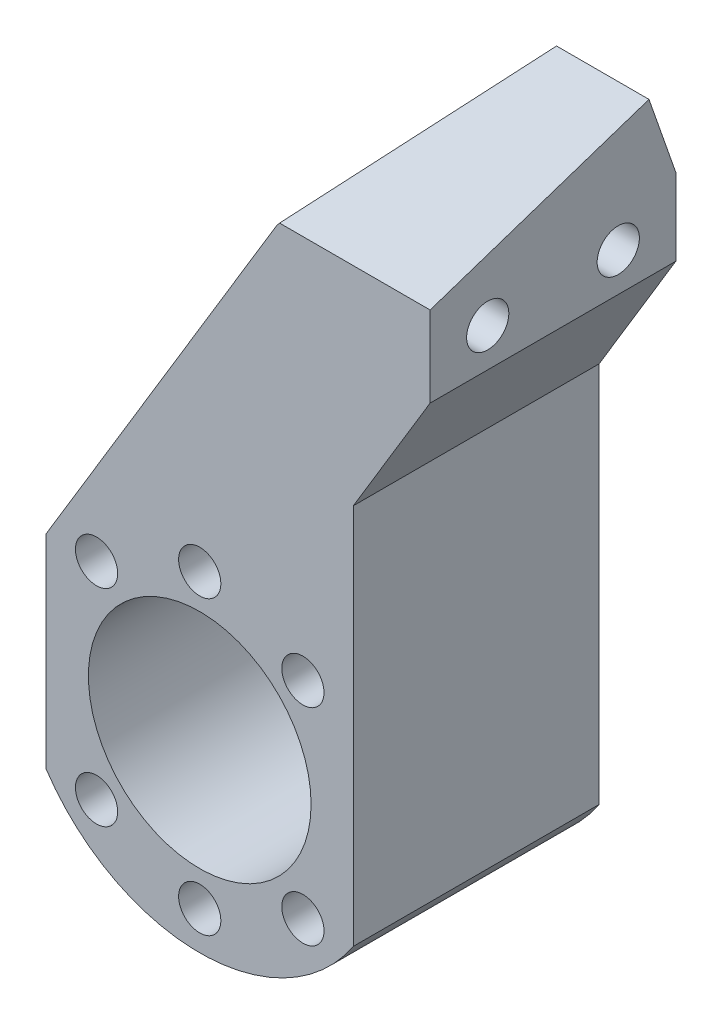
ISO-10303-21;
HEADER;
FILE_DESCRIPTION(('STEP AP214'),'2;1');
FILE_NAME('part.step','',(''),(''),'','','');
FILE_SCHEMA(('AUTOMOTIVE_DESIGN { 1 0 10303 214 1 1 1 1 }'));
ENDSEC;
DATA;
#1=APPLICATION_CONTEXT('core data for automotive mechanical design processes');
#2=APPLICATION_PROTOCOL_DEFINITION('international standard','automotive_design',2000,#1);
#3=PRODUCT_CONTEXT('',#1,'mechanical');
#4=PRODUCT('Part','Part','',(#3));
#5=PRODUCT_RELATED_PRODUCT_CATEGORY('part','',(#4));
#6=PRODUCT_DEFINITION_FORMATION('','',#4);
#7=PRODUCT_DEFINITION_CONTEXT('part definition',#1,'design');
#8=PRODUCT_DEFINITION('design','',#6,#7);
#9=PRODUCT_DEFINITION_SHAPE('','',#8);
#10=(LENGTH_UNIT() NAMED_UNIT(*) SI_UNIT(.MILLI.,.METRE.));
#11=(NAMED_UNIT(*) PLANE_ANGLE_UNIT() SI_UNIT($,.RADIAN.));
#12=(NAMED_UNIT(*) SI_UNIT($,.STERADIAN.) SOLID_ANGLE_UNIT());
#13=UNCERTAINTY_MEASURE_WITH_UNIT(LENGTH_MEASURE(1.E-05),#10,'distance_accuracy_value','');
#14=(GEOMETRIC_REPRESENTATION_CONTEXT(3) GLOBAL_UNCERTAINTY_ASSIGNED_CONTEXT((#13)) GLOBAL_UNIT_ASSIGNED_CONTEXT((#10,
#11,#12)) REPRESENTATION_CONTEXT('',''));
#15=CARTESIAN_POINT('',(0.,0.,0.));
#16=DIRECTION('',(0.,0.,1.));
#17=DIRECTION('',(1.,0.,0.));
#18=AXIS2_PLACEMENT_3D('',#15,#16,#17);
#19=CARTESIAN_POINT('',(0.,0.,32.));
#20=DIRECTION('',(0.,0.,-1.));
#21=DIRECTION('',(-1.,0.,0.));
#22=AXIS2_PLACEMENT_3D('',#19,#20,#21);
#23=PLANE('',#22);
#24=DIRECTION('',(1.,0.,0.));
#25=VECTOR('',#24,1.);
#26=CARTESIAN_POINT('',(10.,63.5009960714216,32.));
#27=LINE('',#26,#25);
#28=CARTESIAN_POINT('',(10.3981382458224,63.5009960714216,32.));
#29=VERTEX_POINT('',#28);
#30=CARTESIAN_POINT('',(30.,63.5009960714216,32.));
#31=VERTEX_POINT('',#30);
#32=EDGE_CURVE('E174',#29,#31,#27,.T.);
#33=ORIENTED_EDGE('',*,*,#32,.F.);
#34=DIRECTION('',(0.622917300632838,0.782287694248285,0.));
#35=VECTOR('',#34,1.);
#36=CARTESIAN_POINT('',(10.,63.0009960714216,32.));
#37=LINE('',#36,#35);
#38=CARTESIAN_POINT('',(10.,63.0009960714216,32.));
#39=VERTEX_POINT('',#38);
#40=EDGE_CURVE('E186',#39,#29,#37,.T.);
#41=ORIENTED_EDGE('',*,*,#40,.F.);
#42=DIRECTION('',(-0.516511027740022,-0.856280537103901,0.));
#43=VECTOR('',#42,1.);
#44=CARTESIAN_POINT('',(10.,63.0009960714216,32.));
#45=LINE('',#44,#43);
#46=CARTESIAN_POINT('',(-20.,13.2664991614216,32.));
#47=VERTEX_POINT('',#46);
#48=EDGE_CURVE('E168',#39,#47,#45,.T.);
#49=ORIENTED_EDGE('',*,*,#48,.T.);
#50=DIRECTION('',(0.,-1.,0.));
#51=VECTOR('',#50,1.);
#52=CARTESIAN_POINT('',(-20.,13.2664991614216,32.));
#53=LINE('',#52,#51);
#54=CARTESIAN_POINT('',(-20.,-13.2664991614216,32.));
#55=VERTEX_POINT('',#54);
#56=EDGE_CURVE('E259',#47,#55,#53,.T.);
#57=ORIENTED_EDGE('',*,*,#56,.T.);
#58=CARTESIAN_POINT('',(0.,0.,32.));
#59=DIRECTION('',(0.,0.,1.));
#60=DIRECTION('',(1.,0.,0.));
#61=AXIS2_PLACEMENT_3D('',#58,#59,#60);
#62=CIRCLE('',#61,24.);
#63=CARTESIAN_POINT('',(20.,-13.2664991614216,32.));
#64=VERTEX_POINT('',#63);
#65=EDGE_CURVE('E261',#55,#64,#62,.T.);
#66=ORIENTED_EDGE('',*,*,#65,.T.);
#67=DIRECTION('',(0.,1.,0.));
#68=VECTOR('',#67,1.);
#69=CARTESIAN_POINT('',(20.,13.2664991614216,32.));
#70=LINE('',#69,#68);
#71=CARTESIAN_POINT('',(20.,36.4228304347549,32.));
#72=VERTEX_POINT('',#71);
#73=EDGE_CURVE('E256',#64,#72,#70,.T.);
#74=ORIENTED_EDGE('',*,*,#73,.T.);
#75=DIRECTION('',(0.516511027740023,0.856280537103902,0.));
#76=VECTOR('',#75,1.);
#77=CARTESIAN_POINT('',(20.,36.4228304347549,32.));
#78=LINE('',#77,#76);
#79=CARTESIAN_POINT('',(30.,53.0009960714216,32.));
#80=VERTEX_POINT('',#79);
#81=EDGE_CURVE('E166',#72,#80,#78,.T.);
#82=ORIENTED_EDGE('',*,*,#81,.T.);
#83=DIRECTION('',(0.,1.,0.));
#84=VECTOR('',#83,1.);
#85=CARTESIAN_POINT('',(30.,63.0009960714216,32.));
#86=LINE('',#85,#84);
#87=EDGE_CURVE('E154',#80,#31,#86,.T.);
#88=ORIENTED_EDGE('',*,*,#87,.T.);
#89=EDGE_LOOP('',(#33,#41,#49,#57,#66,#74,#82,#88));
#90=FACE_BOUND('',#89,.T.);
#91=CARTESIAN_POINT('',(0.,0.,32.));
#92=DIRECTION('',(0.,0.,1.));
#93=DIRECTION('',(1.,0.,0.));
#94=AXIS2_PLACEMENT_3D('',#91,#92,#93);
#95=CIRCLE('',#94,14.5);
#96=CARTESIAN_POINT('',(14.5,0.,32.));
#97=VERTEX_POINT('',#96);
#98=EDGE_CURVE('E265',#97,#97,#95,.T.);
#99=ORIENTED_EDGE('',*,*,#98,.F.);
#100=EDGE_LOOP('',(#99));
#101=FACE_BOUND('',#100,.T.);
#102=CARTESIAN_POINT('',(0.,19.,32.));
#103=DIRECTION('',(0.,0.,1.));
#104=DIRECTION('',(1.,0.,0.));
#105=AXIS2_PLACEMENT_3D('',#102,#103,#104);
#106=CIRCLE('',#105,2.75);
#107=CARTESIAN_POINT('',(2.75,19.,32.));
#108=VERTEX_POINT('',#107);
#109=EDGE_CURVE('E271',#108,#108,#106,.T.);
#110=ORIENTED_EDGE('',*,*,#109,.F.);
#111=EDGE_LOOP('',(#110));
#112=FACE_BOUND('',#111,.T.);
#113=CARTESIAN_POINT('',(-13.4350288425444,13.4350288425444,32.));
#114=DIRECTION('',(0.,0.,1.));
#115=DIRECTION('',(1.,0.,0.));
#116=AXIS2_PLACEMENT_3D('',#113,#114,#115);
#117=CIRCLE('',#116,2.75);
#118=CARTESIAN_POINT('',(-10.6850288425444,13.4350288425444,32.));
#119=VERTEX_POINT('',#118);
#120=EDGE_CURVE('E277',#119,#119,#117,.T.);
#121=ORIENTED_EDGE('',*,*,#120,.F.);
#122=EDGE_LOOP('',(#121));
#123=FACE_BOUND('',#122,.T.);
#124=CARTESIAN_POINT('',(13.4350288425444,13.4350288425444,32.));
#125=DIRECTION('',(0.,0.,1.));
#126=DIRECTION('',(1.,0.,0.));
#127=AXIS2_PLACEMENT_3D('',#124,#125,#126);
#128=CIRCLE('',#127,2.75);
#129=CARTESIAN_POINT('',(16.1850288425444,13.4350288425444,32.));
#130=VERTEX_POINT('',#129);
#131=EDGE_CURVE('E283',#130,#130,#128,.T.);
#132=ORIENTED_EDGE('',*,*,#131,.F.);
#133=EDGE_LOOP('',(#132));
#134=FACE_BOUND('',#133,.T.);
#135=CARTESIAN_POINT('',(0.,-19.,32.));
#136=DIRECTION('',(0.,0.,1.));
#137=DIRECTION('',(1.,0.,0.));
#138=AXIS2_PLACEMENT_3D('',#135,#136,#137);
#139=CIRCLE('',#138,2.75);
#140=CARTESIAN_POINT('',(2.75,-19.,32.));
#141=VERTEX_POINT('',#140);
#142=EDGE_CURVE('E289',#141,#141,#139,.T.);
#143=ORIENTED_EDGE('',*,*,#142,.F.);
#144=EDGE_LOOP('',(#143));
#145=FACE_BOUND('',#144,.T.);
#146=CARTESIAN_POINT('',(13.4350288425444,-13.4350288425444,32.));
#147=DIRECTION('',(0.,0.,1.));
#148=DIRECTION('',(1.,0.,0.));
#149=AXIS2_PLACEMENT_3D('',#146,#147,#148);
#150=CIRCLE('',#149,2.75);
#151=CARTESIAN_POINT('',(16.1850288425444,-13.4350288425444,32.));
#152=VERTEX_POINT('',#151);
#153=EDGE_CURVE('E295',#152,#152,#150,.T.);
#154=ORIENTED_EDGE('',*,*,#153,.F.);
#155=EDGE_LOOP('',(#154));
#156=FACE_BOUND('',#155,.T.);
#157=CARTESIAN_POINT('',(-13.4350288425444,-13.4350288425444,32.));
#158=DIRECTION('',(0.,0.,1.));
#159=DIRECTION('',(1.,0.,0.));
#160=AXIS2_PLACEMENT_3D('',#157,#158,#159);
#161=CIRCLE('',#160,2.75);
#162=CARTESIAN_POINT('',(-10.6850288425444,-13.4350288425444,32.));
#163=VERTEX_POINT('',#162);
#164=EDGE_CURVE('E301',#163,#163,#161,.T.);
#165=ORIENTED_EDGE('',*,*,#164,.F.);
#166=EDGE_LOOP('',(#165));
#167=FACE_BOUND('',#166,.T.);
#168=ADVANCED_FACE('F39',(#90,#101,#112,#123,#134,#145,#156,#167),#23,.F.);
#169=CARTESIAN_POINT('',(0.,0.,0.));
#170=DIRECTION('',(0.,0.,-1.));
#171=DIRECTION('',(-1.,0.,0.));
#172=AXIS2_PLACEMENT_3D('',#169,#170,#171);
#173=PLANE('',#172);
#174=CARTESIAN_POINT('',(13.4350288425444,-13.4350288425444,0.));
#175=DIRECTION('',(0.,0.,1.));
#176=DIRECTION('',(1.,0.,0.));
#177=AXIS2_PLACEMENT_3D('',#174,#175,#176);
#178=CIRCLE('',#177,2.75);
#179=CARTESIAN_POINT('',(16.1850288425444,-13.4350288425444,0.));
#180=VERTEX_POINT('',#179);
#181=EDGE_CURVE('E298',#180,#180,#178,.T.);
#182=ORIENTED_EDGE('',*,*,#181,.T.);
#183=EDGE_LOOP('',(#182));
#184=FACE_BOUND('',#183,.T.);
#185=CARTESIAN_POINT('',(13.4350288425444,13.4350288425444,0.));
#186=DIRECTION('',(0.,0.,1.));
#187=DIRECTION('',(1.,0.,0.));
#188=AXIS2_PLACEMENT_3D('',#185,#186,#187);
#189=CIRCLE('',#188,2.75);
#190=CARTESIAN_POINT('',(16.1850288425444,13.4350288425444,0.));
#191=VERTEX_POINT('',#190);
#192=EDGE_CURVE('E286',#191,#191,#189,.T.);
#193=ORIENTED_EDGE('',*,*,#192,.T.);
#194=EDGE_LOOP('',(#193));
#195=FACE_BOUND('',#194,.T.);
#196=CARTESIAN_POINT('',(0.,19.,0.));
#197=DIRECTION('',(0.,0.,1.));
#198=DIRECTION('',(1.,0.,0.));
#199=AXIS2_PLACEMENT_3D('',#196,#197,#198);
#200=CIRCLE('',#199,2.75);
#201=CARTESIAN_POINT('',(2.75,19.,0.));
#202=VERTEX_POINT('',#201);
#203=EDGE_CURVE('E274',#202,#202,#200,.T.);
#204=ORIENTED_EDGE('',*,*,#203,.T.);
#205=EDGE_LOOP('',(#204));
#206=FACE_BOUND('',#205,.T.);
#207=DIRECTION('',(0.,-1.,0.));
#208=VECTOR('',#207,1.);
#209=CARTESIAN_POINT('',(-20.,13.2664991614216,0.));
#210=LINE('',#209,#208);
#211=CARTESIAN_POINT('',(-20.,13.2664991614216,0.));
#212=VERTEX_POINT('',#211);
#213=CARTESIAN_POINT('',(-20.,-13.2664991614216,0.));
#214=VERTEX_POINT('',#213);
#215=EDGE_CURVE('E253',#212,#214,#210,.T.);
#216=ORIENTED_EDGE('',*,*,#215,.F.);
#217=DIRECTION('',(0.516511027740022,0.856280537103902,0.));
#218=VECTOR('',#217,1.);
#219=CARTESIAN_POINT('',(10.,63.0009960714216,0.));
#220=LINE('',#219,#218);
#221=CARTESIAN_POINT('',(10.,63.0009960714216,0.));
#222=VERTEX_POINT('',#221);
#223=EDGE_CURVE('E162',#212,#222,#220,.T.);
#224=ORIENTED_EDGE('',*,*,#223,.T.);
#225=DIRECTION('',(1.,0.,0.));
#226=VECTOR('',#225,1.);
#227=CARTESIAN_POINT('',(10.,63.0009960714216,0.));
#228=LINE('',#227,#226);
#229=CARTESIAN_POINT('',(30.,63.0009960714216,0.));
#230=VERTEX_POINT('',#229);
#231=EDGE_CURVE('E159',#222,#230,#228,.T.);
#232=ORIENTED_EDGE('',*,*,#231,.T.);
#233=DIRECTION('',(0.,-1.,0.));
#234=VECTOR('',#233,1.);
#235=CARTESIAN_POINT('',(30.,63.0009960714216,0.));
#236=LINE('',#235,#234);
#237=CARTESIAN_POINT('',(30.,53.0009960714216,0.));
#238=VERTEX_POINT('',#237);
#239=EDGE_CURVE('E140',#230,#238,#236,.T.);
#240=ORIENTED_EDGE('',*,*,#239,.T.);
#241=DIRECTION('',(-0.516511027740022,-0.856280537103901,0.));
#242=VECTOR('',#241,1.);
#243=CARTESIAN_POINT('',(20.,36.4228304347549,0.));
#244=LINE('',#243,#242);
#245=CARTESIAN_POINT('',(20.,36.4228304347549,0.));
#246=VERTEX_POINT('',#245);
#247=EDGE_CURVE('E136',#238,#246,#244,.T.);
#248=ORIENTED_EDGE('',*,*,#247,.T.);
#249=DIRECTION('',(0.,1.,0.));
#250=VECTOR('',#249,1.);
#251=CARTESIAN_POINT('',(20.,13.2664991614216,0.));
#252=LINE('',#251,#250);
#253=CARTESIAN_POINT('',(20.,-13.2664991614216,0.));
#254=VERTEX_POINT('',#253);
#255=EDGE_CURVE('E252',#254,#246,#252,.T.);
#256=ORIENTED_EDGE('',*,*,#255,.F.);
#257=CARTESIAN_POINT('',(0.,0.,0.));
#258=DIRECTION('',(0.,0.,1.));
#259=DIRECTION('',(1.,0.,0.));
#260=AXIS2_PLACEMENT_3D('',#257,#258,#259);
#261=CIRCLE('',#260,24.);
#262=EDGE_CURVE('E244',#214,#254,#261,.T.);
#263=ORIENTED_EDGE('',*,*,#262,.F.);
#264=EDGE_LOOP('',(#216,#224,#232,#240,#248,#256,#263));
#265=FACE_BOUND('',#264,.T.);
#266=CARTESIAN_POINT('',(0.,0.,0.));
#267=DIRECTION('',(0.,0.,1.));
#268=DIRECTION('',(1.,0.,0.));
#269=AXIS2_PLACEMENT_3D('',#266,#267,#268);
#270=CIRCLE('',#269,14.5);
#271=CARTESIAN_POINT('',(14.5,0.,0.));
#272=VERTEX_POINT('',#271);
#273=EDGE_CURVE('E268',#272,#272,#270,.T.);
#274=ORIENTED_EDGE('',*,*,#273,.T.);
#275=EDGE_LOOP('',(#274));
#276=FACE_BOUND('',#275,.T.);
#277=CARTESIAN_POINT('',(-13.4350288425444,13.4350288425444,0.));
#278=DIRECTION('',(0.,0.,1.));
#279=DIRECTION('',(1.,0.,0.));
#280=AXIS2_PLACEMENT_3D('',#277,#278,#279);
#281=CIRCLE('',#280,2.75);
#282=CARTESIAN_POINT('',(-10.6850288425444,13.4350288425444,0.));
#283=VERTEX_POINT('',#282);
#284=EDGE_CURVE('E280',#283,#283,#281,.T.);
#285=ORIENTED_EDGE('',*,*,#284,.T.);
#286=EDGE_LOOP('',(#285));
#287=FACE_BOUND('',#286,.T.);
#288=CARTESIAN_POINT('',(0.,-19.,0.));
#289=DIRECTION('',(0.,0.,1.));
#290=DIRECTION('',(1.,0.,0.));
#291=AXIS2_PLACEMENT_3D('',#288,#289,#290);
#292=CIRCLE('',#291,2.75);
#293=CARTESIAN_POINT('',(2.75,-19.,0.));
#294=VERTEX_POINT('',#293);
#295=EDGE_CURVE('E292',#294,#294,#292,.T.);
#296=ORIENTED_EDGE('',*,*,#295,.T.);
#297=EDGE_LOOP('',(#296));
#298=FACE_BOUND('',#297,.T.);
#299=CARTESIAN_POINT('',(-13.4350288425444,-13.4350288425444,0.));
#300=DIRECTION('',(0.,0.,1.));
#301=DIRECTION('',(1.,0.,0.));
#302=AXIS2_PLACEMENT_3D('',#299,#300,#301);
#303=CIRCLE('',#302,2.75);
#304=CARTESIAN_POINT('',(-10.6850288425444,-13.4350288425444,0.));
#305=VERTEX_POINT('',#304);
#306=EDGE_CURVE('E304',#305,#305,#303,.T.);
#307=ORIENTED_EDGE('',*,*,#306,.T.);
#308=EDGE_LOOP('',(#307));
#309=FACE_BOUND('',#308,.T.);
#310=ADVANCED_FACE('F217',(#184,#195,#206,#265,#276,#287,#298,#309),#173,.T.);
#311=CARTESIAN_POINT('',(-20.,13.2664991614216,32.));
#312=DIRECTION('',(1.,0.,0.));
#313=DIRECTION('',(0.,0.,-1.));
#314=AXIS2_PLACEMENT_3D('',#311,#312,#313);
#315=PLANE('',#314);
#316=ORIENTED_EDGE('',*,*,#215,.T.);
#317=DIRECTION('',(0.,0.,-1.));
#318=VECTOR('',#317,1.);
#319=CARTESIAN_POINT('',(-20.,-13.2664991614216,32.));
#320=LINE('',#319,#318);
#321=EDGE_CURVE('E47',#55,#214,#320,.T.);
#322=ORIENTED_EDGE('',*,*,#321,.F.);
#323=ORIENTED_EDGE('',*,*,#56,.F.);
#324=DIRECTION('',(0.,0.,-1.));
#325=VECTOR('',#324,1.);
#326=CARTESIAN_POINT('',(-20.,13.2664991614216,32.));
#327=LINE('',#326,#325);
#328=EDGE_CURVE('E11',#47,#212,#327,.T.);
#329=ORIENTED_EDGE('',*,*,#328,.T.);
#330=EDGE_LOOP('',(#316,#322,#323,#329));
#331=FACE_BOUND('',#330,.T.);
#332=ADVANCED_FACE('F41',(#331),#315,.F.);
#333=CARTESIAN_POINT('',(0.,0.,32.));
#334=DIRECTION('',(0.,0.,-1.));
#335=DIRECTION('',(-1.,0.,0.));
#336=AXIS2_PLACEMENT_3D('',#333,#334,#335);
#337=CYLINDRICAL_SURFACE('',#336,24.);
#338=ORIENTED_EDGE('',*,*,#262,.T.);
#339=DIRECTION('',(0.,0.,-1.));
#340=VECTOR('',#339,1.);
#341=CARTESIAN_POINT('',(20.,-13.2664991614216,32.));
#342=LINE('',#341,#340);
#343=EDGE_CURVE('E247',#64,#254,#342,.T.);
#344=ORIENTED_EDGE('',*,*,#343,.F.);
#345=ORIENTED_EDGE('',*,*,#65,.F.);
#346=ORIENTED_EDGE('',*,*,#321,.T.);
#347=EDGE_LOOP('',(#338,#344,#345,#346));
#348=FACE_BOUND('',#347,.T.);
#349=ADVANCED_FACE('F233',(#348),#337,.T.);
#350=CARTESIAN_POINT('',(20.,13.2664991614216,32.));
#351=DIRECTION('',(-1.,0.,0.));
#352=DIRECTION('',(0.,0.,1.));
#353=AXIS2_PLACEMENT_3D('',#350,#351,#352);
#354=PLANE('',#353);
#355=ORIENTED_EDGE('',*,*,#255,.T.);
#356=DIRECTION('',(0.,0.,-1.));
#357=VECTOR('',#356,1.);
#358=CARTESIAN_POINT('',(20.,36.4228304347549,102.523188972783));
#359=LINE('',#358,#357);
#360=EDGE_CURVE('E147',#72,#246,#359,.T.);
#361=ORIENTED_EDGE('',*,*,#360,.F.);
#362=ORIENTED_EDGE('',*,*,#73,.F.);
#363=ORIENTED_EDGE('',*,*,#343,.T.);
#364=EDGE_LOOP('',(#355,#361,#362,#363));
#365=FACE_BOUND('',#364,.T.);
#366=ADVANCED_FACE('F231',(#365),#354,.F.);
#367=CARTESIAN_POINT('',(0.,0.,32.));
#368=DIRECTION('',(0.,0.,-1.));
#369=DIRECTION('',(-1.,0.,0.));
#370=AXIS2_PLACEMENT_3D('',#367,#368,#369);
#371=CYLINDRICAL_SURFACE('',#370,14.5);
#372=ORIENTED_EDGE('',*,*,#98,.T.);
#373=EDGE_LOOP('',(#372));
#374=FACE_BOUND('',#373,.T.);
#375=ORIENTED_EDGE('',*,*,#273,.F.);
#376=EDGE_LOOP('',(#375));
#377=FACE_BOUND('',#376,.T.);
#378=ADVANCED_FACE('F228',(#374,#377),#371,.F.);
#379=CARTESIAN_POINT('',(0.,19.,32.));
#380=DIRECTION('',(0.,0.,-1.));
#381=DIRECTION('',(-1.,0.,0.));
#382=AXIS2_PLACEMENT_3D('',#379,#380,#381);
#383=CYLINDRICAL_SURFACE('',#382,2.75);
#384=ORIENTED_EDGE('',*,*,#109,.T.);
#385=EDGE_LOOP('',(#384));
#386=FACE_BOUND('',#385,.T.);
#387=ORIENTED_EDGE('',*,*,#203,.F.);
#388=EDGE_LOOP('',(#387));
#389=FACE_BOUND('',#388,.T.);
#390=ADVANCED_FACE('F364',(#386,#389),#383,.F.);
#391=CARTESIAN_POINT('',(-13.4350288425444,13.4350288425444,32.));
#392=DIRECTION('',(0.,0.,-1.));
#393=DIRECTION('',(-1.,0.,0.));
#394=AXIS2_PLACEMENT_3D('',#391,#392,#393);
#395=CYLINDRICAL_SURFACE('',#394,2.75);
#396=ORIENTED_EDGE('',*,*,#120,.T.);
#397=EDGE_LOOP('',(#396));
#398=FACE_BOUND('',#397,.T.);
#399=ORIENTED_EDGE('',*,*,#284,.F.);
#400=EDGE_LOOP('',(#399));
#401=FACE_BOUND('',#400,.T.);
#402=ADVANCED_FACE('F361',(#398,#401),#395,.F.);
#403=CARTESIAN_POINT('',(13.4350288425444,13.4350288425444,32.));
#404=DIRECTION('',(0.,0.,-1.));
#405=DIRECTION('',(-1.,0.,0.));
#406=AXIS2_PLACEMENT_3D('',#403,#404,#405);
#407=CYLINDRICAL_SURFACE('',#406,2.75);
#408=ORIENTED_EDGE('',*,*,#131,.T.);
#409=EDGE_LOOP('',(#408));
#410=FACE_BOUND('',#409,.T.);
#411=ORIENTED_EDGE('',*,*,#192,.F.);
#412=EDGE_LOOP('',(#411));
#413=FACE_BOUND('',#412,.T.);
#414=ADVANCED_FACE('F357',(#410,#413),#407,.F.);
#415=CARTESIAN_POINT('',(0.,-19.,32.));
#416=DIRECTION('',(0.,0.,-1.));
#417=DIRECTION('',(-1.,0.,0.));
#418=AXIS2_PLACEMENT_3D('',#415,#416,#417);
#419=CYLINDRICAL_SURFACE('',#418,2.75);
#420=ORIENTED_EDGE('',*,*,#142,.T.);
#421=EDGE_LOOP('',(#420));
#422=FACE_BOUND('',#421,.T.);
#423=ORIENTED_EDGE('',*,*,#295,.F.);
#424=EDGE_LOOP('',(#423));
#425=FACE_BOUND('',#424,.T.);
#426=ADVANCED_FACE('F353',(#422,#425),#419,.F.);
#427=CARTESIAN_POINT('',(13.4350288425444,-13.4350288425444,32.));
#428=DIRECTION('',(0.,0.,-1.));
#429=DIRECTION('',(-1.,0.,0.));
#430=AXIS2_PLACEMENT_3D('',#427,#428,#429);
#431=CYLINDRICAL_SURFACE('',#430,2.75);
#432=ORIENTED_EDGE('',*,*,#153,.T.);
#433=EDGE_LOOP('',(#432));
#434=FACE_BOUND('',#433,.T.);
#435=ORIENTED_EDGE('',*,*,#181,.F.);
#436=EDGE_LOOP('',(#435));
#437=FACE_BOUND('',#436,.T.);
#438=ADVANCED_FACE('F349',(#434,#437),#431,.F.);
#439=CARTESIAN_POINT('',(-13.4350288425444,-13.4350288425444,32.));
#440=DIRECTION('',(0.,0.,-1.));
#441=DIRECTION('',(-1.,0.,0.));
#442=AXIS2_PLACEMENT_3D('',#439,#440,#441);
#443=CYLINDRICAL_SURFACE('',#442,2.75);
#444=ORIENTED_EDGE('',*,*,#164,.T.);
#445=EDGE_LOOP('',(#444));
#446=FACE_BOUND('',#445,.T.);
#447=ORIENTED_EDGE('',*,*,#306,.F.);
#448=EDGE_LOOP('',(#447));
#449=FACE_BOUND('',#448,.T.);
#450=ADVANCED_FACE('F341',(#446,#449),#443,.F.);
#451=CARTESIAN_POINT('',(20.,36.4228304347549,102.523188972783));
#452=DIRECTION('',(0.856280537103901,-0.516511027740022,0.));
#453=DIRECTION('',(0.516511027740023,0.856280537103902,0.));
#454=AXIS2_PLACEMENT_3D('',#451,#452,#453);
#455=PLANE('',#454);
#456=ORIENTED_EDGE('',*,*,#81,.F.);
#457=ORIENTED_EDGE('',*,*,#360,.T.);
#458=ORIENTED_EDGE('',*,*,#247,.F.);
#459=DIRECTION('',(0.,0.,-1.));
#460=VECTOR('',#459,1.);
#461=CARTESIAN_POINT('',(30.,53.0009960714216,102.523188972783));
#462=LINE('',#461,#460);
#463=EDGE_CURVE('E145',#80,#238,#462,.T.);
#464=ORIENTED_EDGE('',*,*,#463,.F.);
#465=EDGE_LOOP('',(#456,#457,#458,#464));
#466=FACE_BOUND('',#465,.T.);
#467=ADVANCED_FACE('F313',(#466),#455,.T.);
#468=CARTESIAN_POINT('',(30.,63.0009960714216,102.523188972783));
#469=DIRECTION('',(1.,0.,0.));
#470=DIRECTION('',(0.,0.,-1.));
#471=AXIS2_PLACEMENT_3D('',#468,#469,#470);
#472=PLANE('',#471);
#473=CARTESIAN_POINT('',(30.,58.0009960714216,24.5));
#474=DIRECTION('',(1.,0.,0.));
#475=DIRECTION('',(0.,0.,-1.));
#476=AXIS2_PLACEMENT_3D('',#473,#474,#475);
#477=CIRCLE('',#476,2.75);
#478=CARTESIAN_POINT('',(30.,58.0009960714216,21.75));
#479=VERTEX_POINT('',#478);
#480=EDGE_CURVE('E165',#479,#479,#477,.T.);
#481=ORIENTED_EDGE('',*,*,#480,.F.);
#482=EDGE_LOOP('',(#481));
#483=FACE_BOUND('',#482,.T.);
#484=CARTESIAN_POINT('',(30.,58.0009960714216,7.5));
#485=DIRECTION('',(1.,0.,0.));
#486=DIRECTION('',(0.,0.,-1.));
#487=AXIS2_PLACEMENT_3D('',#484,#485,#486);
#488=CIRCLE('',#487,2.75);
#489=CARTESIAN_POINT('',(30.,58.0009960714216,4.75));
#490=VERTEX_POINT('',#489);
#491=EDGE_CURVE('E171',#490,#490,#488,.T.);
#492=ORIENTED_EDGE('',*,*,#491,.F.);
#493=EDGE_LOOP('',(#492));
#494=FACE_BOUND('',#493,.T.);
#495=ORIENTED_EDGE('',*,*,#87,.F.);
#496=ORIENTED_EDGE('',*,*,#463,.T.);
#497=ORIENTED_EDGE('',*,*,#239,.F.);
#498=DIRECTION('',(0.,0.943858356366017,0.330350424728106));
#499=VECTOR('',#498,1.);
#500=CARTESIAN_POINT('',(30.,63.0009960714216,0.));
#501=LINE('',#500,#499);
#502=CARTESIAN_POINT('',(30.,73.0009960714216,3.5));
#503=VERTEX_POINT('',#502);
#504=EDGE_CURVE('E183',#230,#503,#501,.T.);
#505=ORIENTED_EDGE('',*,*,#504,.T.);
#506=DIRECTION('',(0.,-0.316227766016838,0.948683298050514));
#507=VECTOR('',#506,1.);
#508=CARTESIAN_POINT('',(30.,63.5009960714216,32.));
#509=LINE('',#508,#507);
#510=EDGE_CURVE('E179',#503,#31,#509,.T.);
#511=ORIENTED_EDGE('',*,*,#510,.T.);
#512=EDGE_LOOP('',(#495,#496,#497,#505,#511));
#513=FACE_BOUND('',#512,.T.);
#514=ADVANCED_FACE('F314',(#483,#494,#513),#472,.T.);
#515=CARTESIAN_POINT('',(10.,63.0009960714216,102.523188972783));
#516=DIRECTION('',(-0.856280537103901,0.516511027740022,0.));
#517=DIRECTION('',(-0.516511027740022,-0.856280537103901,0.));
#518=AXIS2_PLACEMENT_3D('',#515,#516,#517);
#519=PLANE('',#518);
#520=CARTESIAN_POINT('',(6.98398477275359,58.0009960714216,7.5));
#521=DIRECTION('',(-0.856280537103901,0.516511027740022,0.));
#522=DIRECTION('',(0.516511027740022,0.856280537103901,0.));
#523=AXIS2_PLACEMENT_3D('',#520,#521,#522);
#524=ELLIPSE('',#523,7.00704937226894,6.);
#525=CARTESIAN_POINT('',(10.,63.0009960714216,10.8166247903555));
#526=VERTEX_POINT('',#525);
#527=CARTESIAN_POINT('',(10.,63.0009960714216,4.18337520964467));
#528=VERTEX_POINT('',#527);
#529=EDGE_CURVE('E53',#526,#528,#524,.F.);
#530=ORIENTED_EDGE('',*,*,#529,.T.);
#531=DIRECTION('',(0.,0.,-1.));
#532=VECTOR('',#531,1.);
#533=CARTESIAN_POINT('',(10.,63.0009960714216,102.523188972783));
#534=LINE('',#533,#532);
#535=EDGE_CURVE('E128',#528,#222,#534,.T.);
#536=ORIENTED_EDGE('',*,*,#535,.T.);
#537=ORIENTED_EDGE('',*,*,#223,.F.);
#538=ORIENTED_EDGE('',*,*,#328,.F.);
#539=ORIENTED_EDGE('',*,*,#48,.F.);
#540=CARTESIAN_POINT('',(10.,63.0009960714216,27.8166247903554));
#541=VERTEX_POINT('',#540);
#542=EDGE_CURVE('E138',#39,#541,#534,.T.);
#543=ORIENTED_EDGE('',*,*,#542,.T.);
#544=CARTESIAN_POINT('',(6.98398477275359,58.0009960714216,24.5));
#545=DIRECTION('',(-0.856280537103901,0.516511027740022,0.));
#546=DIRECTION('',(0.516511027740022,0.856280537103901,0.));
#547=AXIS2_PLACEMENT_3D('',#544,#545,#546);
#548=ELLIPSE('',#547,7.00704937226894,6.);
#549=CARTESIAN_POINT('',(10.,63.0009960714216,21.1833752096447));
#550=VERTEX_POINT('',#549);
#551=EDGE_CURVE('E60',#541,#550,#548,.F.);
#552=ORIENTED_EDGE('',*,*,#551,.T.);
#553=EDGE_CURVE('E130',#550,#526,#534,.T.);
#554=ORIENTED_EDGE('',*,*,#553,.T.);
#555=EDGE_LOOP('',(#530,#536,#537,#538,#539,#543,#552,#554));
#556=FACE_BOUND('',#555,.T.);
#557=ADVANCED_FACE('F126',(#556),#519,.T.);
#558=CARTESIAN_POINT('',(-20.001,58.0009960714216,7.5));
#559=DIRECTION('',(1.,0.,0.));
#560=DIRECTION('',(0.,0.,-1.));
#561=AXIS2_PLACEMENT_3D('',#558,#559,#560);
#562=CYLINDRICAL_SURFACE('',#561,2.75);
#563=CARTESIAN_POINT('',(20.,58.0009960714216,7.5));
#564=DIRECTION('',(1.,0.,0.));
#565=DIRECTION('',(0.,0.,-1.));
#566=AXIS2_PLACEMENT_3D('',#563,#564,#565);
#567=CIRCLE('',#566,2.75);
#568=CARTESIAN_POINT('',(20.,58.0009960714216,4.75));
#569=VERTEX_POINT('',#568);
#570=EDGE_CURVE('E123',#569,#569,#567,.T.);
#571=ORIENTED_EDGE('',*,*,#570,.F.);
#572=EDGE_LOOP('',(#571));
#573=FACE_BOUND('',#572,.T.);
#574=ORIENTED_EDGE('',*,*,#491,.T.);
#575=EDGE_LOOP('',(#574));
#576=FACE_BOUND('',#575,.T.);
#577=ADVANCED_FACE('F334',(#573,#576),#562,.F.);
#578=CARTESIAN_POINT('',(-20.001,58.0009960714216,24.5));
#579=DIRECTION('',(1.,0.,0.));
#580=DIRECTION('',(0.,0.,-1.));
#581=AXIS2_PLACEMENT_3D('',#578,#579,#580);
#582=CYLINDRICAL_SURFACE('',#581,2.75);
#583=CARTESIAN_POINT('',(20.,58.0009960714216,24.5));
#584=DIRECTION('',(1.,0.,0.));
#585=DIRECTION('',(0.,0.,-1.));
#586=AXIS2_PLACEMENT_3D('',#583,#584,#585);
#587=CIRCLE('',#586,2.75);
#588=CARTESIAN_POINT('',(20.,58.0009960714216,21.75));
#589=VERTEX_POINT('',#588);
#590=EDGE_CURVE('E196',#589,#589,#587,.T.);
#591=ORIENTED_EDGE('',*,*,#590,.F.);
#592=EDGE_LOOP('',(#591));
#593=FACE_BOUND('',#592,.T.);
#594=ORIENTED_EDGE('',*,*,#480,.T.);
#595=EDGE_LOOP('',(#594));
#596=FACE_BOUND('',#595,.T.);
#597=ADVANCED_FACE('F329',(#593,#596),#582,.F.);
#598=CARTESIAN_POINT('',(10.,63.5009960714216,32.));
#599=DIRECTION('',(0.,0.948683298050514,0.316227766016838));
#600=DIRECTION('',(0.,-0.316227766016838,0.948683298050514));
#601=AXIS2_PLACEMENT_3D('',#598,#599,#600);
#602=PLANE('',#601);
#603=DIRECTION('',(-0.244182433558142,-0.306655334070944,0.919966002212833));
#604=VECTOR('',#603,1.);
#605=CARTESIAN_POINT('',(10.3367346662794,63.4238826815536,32.2313401696041));
#606=LINE('',#605,#604);
#607=CARTESIAN_POINT('',(17.9627649164469,73.0009960714216,3.5));
#608=VERTEX_POINT('',#607);
#609=EDGE_CURVE('E188',#608,#29,#606,.T.);
#610=ORIENTED_EDGE('',*,*,#609,.T.);
#611=ORIENTED_EDGE('',*,*,#32,.T.);
#612=ORIENTED_EDGE('',*,*,#510,.F.);
#613=DIRECTION('',(1.,0.,0.));
#614=VECTOR('',#613,1.);
#615=CARTESIAN_POINT('',(10.,73.0009960714216,3.5));
#616=LINE('',#615,#614);
#617=EDGE_CURVE('E177',#608,#503,#616,.T.);
#618=ORIENTED_EDGE('',*,*,#617,.F.);
#619=EDGE_LOOP('',(#610,#611,#612,#618));
#620=FACE_BOUND('',#619,.T.);
#621=ADVANCED_FACE('F319',(#620),#602,.T.);
#622=CARTESIAN_POINT('',(10.,63.0009960714216,0.));
#623=DIRECTION('',(0.,0.330350424728106,-0.943858356366017));
#624=DIRECTION('',(0.,0.943858356366017,0.330350424728106));
#625=AXIS2_PLACEMENT_3D('',#622,#623,#624);
#626=PLANE('',#625);
#627=DIRECTION('',(0.600804066232422,0.754516895245112,0.264080913335789));
#628=VECTOR('',#627,1.);
#629=CARTESIAN_POINT('',(15.077307030375,69.377307671288,2.23170905995326));
#630=LINE('',#629,#628);
#631=EDGE_CURVE('E131',#222,#608,#630,.T.);
#632=ORIENTED_EDGE('',*,*,#631,.T.);
#633=ORIENTED_EDGE('',*,*,#617,.T.);
#634=ORIENTED_EDGE('',*,*,#504,.F.);
#635=ORIENTED_EDGE('',*,*,#231,.F.);
#636=EDGE_LOOP('',(#632,#633,#634,#635));
#637=FACE_BOUND('',#636,.T.);
#638=ADVANCED_FACE('F320',(#637),#626,.T.);
#639=CARTESIAN_POINT('',(10.,63.0009960714216,32.001));
#640=DIRECTION('',(0.782287694248285,-0.622917300632838,0.));
#641=DIRECTION('',(0.622917300632838,0.782287694248285,0.));
#642=AXIS2_PLACEMENT_3D('',#639,#640,#641);
#643=PLANE('',#642);
#644=ORIENTED_EDGE('',*,*,#535,.F.);
#645=CARTESIAN_POINT('',(6.01861754177656,58.0009960714216,7.5));
#646=DIRECTION('',(0.782287694248285,-0.622917300632838,0.));
#647=DIRECTION('',(0.622917300632838,0.782287694248285,0.));
#648=AXIS2_PLACEMENT_3D('',#645,#646,#647);
#649=ELLIPSE('',#648,7.6698125818859,6.);
#650=EDGE_CURVE('E116',#526,#528,#649,.F.);
#651=ORIENTED_EDGE('',*,*,#650,.F.);
#652=ORIENTED_EDGE('',*,*,#553,.F.);
#653=CARTESIAN_POINT('',(6.01861754177656,58.0009960714216,24.5));
#654=DIRECTION('',(0.782287694248285,-0.622917300632838,0.));
#655=DIRECTION('',(0.622917300632838,0.782287694248285,0.));
#656=AXIS2_PLACEMENT_3D('',#653,#654,#655);
#657=ELLIPSE('',#656,7.66981258188589,6.);
#658=EDGE_CURVE('E194',#541,#550,#657,.F.);
#659=ORIENTED_EDGE('',*,*,#658,.F.);
#660=ORIENTED_EDGE('',*,*,#542,.F.);
#661=ORIENTED_EDGE('',*,*,#40,.T.);
#662=ORIENTED_EDGE('',*,*,#609,.F.);
#663=ORIENTED_EDGE('',*,*,#631,.F.);
#664=EDGE_LOOP('',(#644,#651,#652,#659,#660,#661,#662,#663));
#665=FACE_BOUND('',#664,.T.);
#666=ADVANCED_FACE('F133',(#665),#643,.F.);
#667=CARTESIAN_POINT('',(-20.001,58.0009960714216,24.5));
#668=DIRECTION('',(1.,0.,0.));
#669=DIRECTION('',(0.,0.,-1.));
#670=AXIS2_PLACEMENT_3D('',#667,#668,#669);
#671=CYLINDRICAL_SURFACE('',#670,6.);
#672=ORIENTED_EDGE('',*,*,#658,.T.);
#673=ORIENTED_EDGE('',*,*,#551,.F.);
#674=EDGE_LOOP('',(#672,#673));
#675=FACE_BOUND('',#674,.T.);
#676=CARTESIAN_POINT('',(20.,58.0009960714216,24.5));
#677=DIRECTION('',(1.,0.,0.));
#678=DIRECTION('',(0.,0.,-1.));
#679=AXIS2_PLACEMENT_3D('',#676,#677,#678);
#680=CIRCLE('',#679,6.);
#681=CARTESIAN_POINT('',(20.,58.0009960714216,18.5));
#682=VERTEX_POINT('',#681);
#683=EDGE_CURVE('E199',#682,#682,#680,.T.);
#684=ORIENTED_EDGE('',*,*,#683,.T.);
#685=EDGE_LOOP('',(#684));
#686=FACE_BOUND('',#685,.T.);
#687=ADVANCED_FACE('F327',(#675,#686),#671,.F.);
#688=CARTESIAN_POINT('',(20.,58.0009960714216,24.5));
#689=DIRECTION('',(1.,0.,0.));
#690=DIRECTION('',(0.,0.,-1.));
#691=AXIS2_PLACEMENT_3D('',#688,#689,#690);
#692=PLANE('',#691);
#693=ORIENTED_EDGE('',*,*,#590,.T.);
#694=EDGE_LOOP('',(#693));
#695=FACE_BOUND('',#694,.T.);
#696=ORIENTED_EDGE('',*,*,#683,.F.);
#697=EDGE_LOOP('',(#696));
#698=FACE_BOUND('',#697,.T.);
#699=ADVANCED_FACE('F214',(#695,#698),#692,.F.);
#700=CARTESIAN_POINT('',(-20.001,58.0009960714216,7.5));
#701=DIRECTION('',(1.,0.,0.));
#702=DIRECTION('',(0.,0.,-1.));
#703=AXIS2_PLACEMENT_3D('',#700,#701,#702);
#704=CYLINDRICAL_SURFACE('',#703,6.);
#705=ORIENTED_EDGE('',*,*,#650,.T.);
#706=ORIENTED_EDGE('',*,*,#529,.F.);
#707=EDGE_LOOP('',(#705,#706));
#708=FACE_BOUND('',#707,.T.);
#709=CARTESIAN_POINT('',(20.,58.0009960714216,7.5));
#710=DIRECTION('',(1.,0.,0.));
#711=DIRECTION('',(0.,0.,-1.));
#712=AXIS2_PLACEMENT_3D('',#709,#710,#711);
#713=CIRCLE('',#712,6.);
#714=CARTESIAN_POINT('',(20.,58.0009960714216,1.5));
#715=VERTEX_POINT('',#714);
#716=EDGE_CURVE('E193',#715,#715,#713,.T.);
#717=ORIENTED_EDGE('',*,*,#716,.T.);
#718=EDGE_LOOP('',(#717));
#719=FACE_BOUND('',#718,.T.);
#720=ADVANCED_FACE('F117',(#708,#719),#704,.F.);
#721=CARTESIAN_POINT('',(20.,58.0009960714216,7.5));
#722=DIRECTION('',(1.,0.,0.));
#723=DIRECTION('',(0.,0.,-1.));
#724=AXIS2_PLACEMENT_3D('',#721,#722,#723);
#725=PLANE('',#724);
#726=ORIENTED_EDGE('',*,*,#570,.T.);
#727=EDGE_LOOP('',(#726));
#728=FACE_BOUND('',#727,.T.);
#729=ORIENTED_EDGE('',*,*,#716,.F.);
#730=EDGE_LOOP('',(#729));
#731=FACE_BOUND('',#730,.T.);
#732=ADVANCED_FACE('F207',(#728,#731),#725,.F.);
#733=CLOSED_SHELL('',(#168,#310,#332,#349,#366,#378,#390,#402,#414,#426,#438,#450,#467,#514,
#557,#577,#597,#621,#638,#666,#687,#699,#720,#732));
#734=MANIFOLD_SOLID_BREP('B2',#733);
#735=ADVANCED_BREP_SHAPE_REPRESENTATION('',(#18,#734),#14);
#736=SHAPE_DEFINITION_REPRESENTATION(#9,#735);
ENDSEC;
END-ISO-10303-21;
